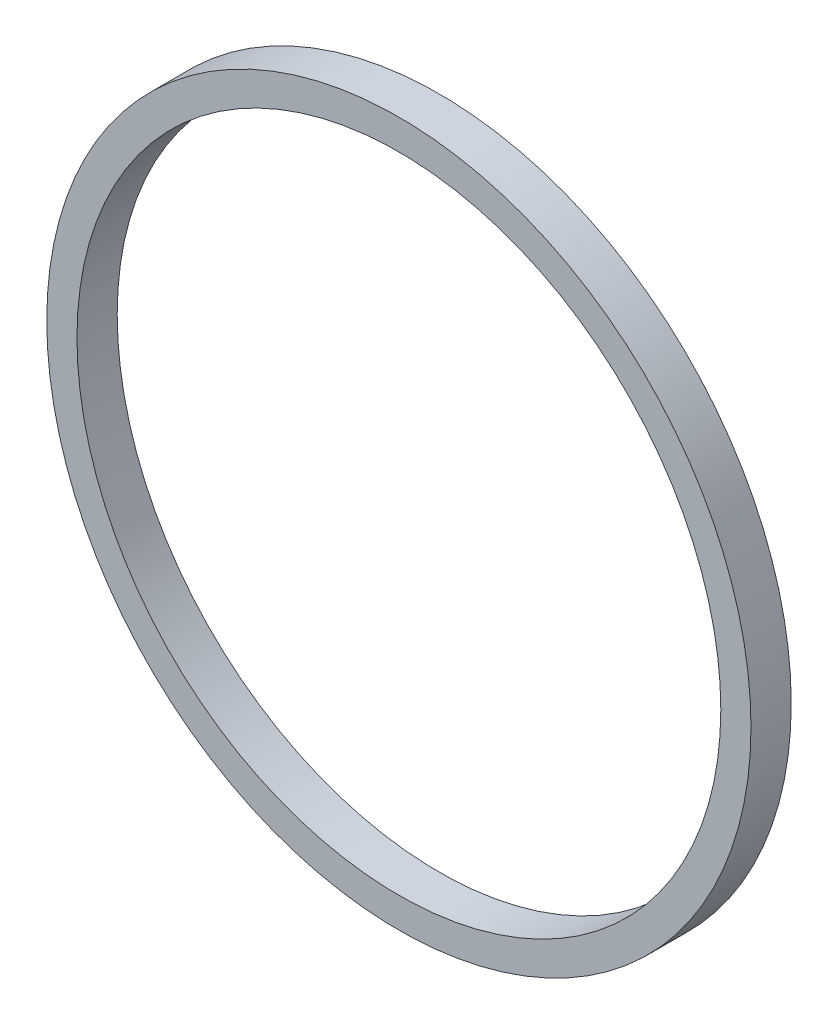
ISO-10303-21;
HEADER;
FILE_DESCRIPTION(('STEP AP214'),'2;1');
FILE_NAME('part.step','',(''),(''),'','','');
FILE_SCHEMA(('AUTOMOTIVE_DESIGN { 1 0 10303 214 1 1 1 1 }'));
ENDSEC;
DATA;
#1=APPLICATION_CONTEXT('core data for automotive mechanical design processes');
#2=APPLICATION_PROTOCOL_DEFINITION('international standard','automotive_design',2000,#1);
#3=PRODUCT_CONTEXT('',#1,'mechanical');
#4=PRODUCT('Part','Part','',(#3));
#5=PRODUCT_RELATED_PRODUCT_CATEGORY('part','',(#4));
#6=PRODUCT_DEFINITION_FORMATION('','',#4);
#7=PRODUCT_DEFINITION_CONTEXT('part definition',#1,'design');
#8=PRODUCT_DEFINITION('design','',#6,#7);
#9=PRODUCT_DEFINITION_SHAPE('','',#8);
#10=(LENGTH_UNIT() NAMED_UNIT(*) SI_UNIT(.MILLI.,.METRE.));
#11=(NAMED_UNIT(*) PLANE_ANGLE_UNIT() SI_UNIT($,.RADIAN.));
#12=(NAMED_UNIT(*) SI_UNIT($,.STERADIAN.) SOLID_ANGLE_UNIT());
#13=UNCERTAINTY_MEASURE_WITH_UNIT(LENGTH_MEASURE(1.E-05),#10,'distance_accuracy_value','');
#14=(GEOMETRIC_REPRESENTATION_CONTEXT(3) GLOBAL_UNCERTAINTY_ASSIGNED_CONTEXT((#13)) GLOBAL_UNIT_ASSIGNED_CONTEXT((#10,
#11,#12)) REPRESENTATION_CONTEXT('',''));
#15=CARTESIAN_POINT('',(0.,0.,0.));
#16=DIRECTION('',(0.,0.,1.));
#17=DIRECTION('',(1.,0.,0.));
#18=AXIS2_PLACEMENT_3D('',#15,#16,#17);
#19=CARTESIAN_POINT('',(0.,0.,2.));
#20=DIRECTION('',(0.,0.,1.));
#21=DIRECTION('',(1.,0.,0.));
#22=AXIS2_PLACEMENT_3D('',#19,#20,#21);
#23=PLANE('',#22);
#24=CARTESIAN_POINT('',(0.,0.,2.));
#25=DIRECTION('',(0.,0.,1.));
#26=DIRECTION('',(1.,0.,0.));
#27=AXIS2_PLACEMENT_3D('',#24,#25,#26);
#28=CIRCLE('',#27,17.5);
#29=CARTESIAN_POINT('',(17.5,0.,2.));
#30=VERTEX_POINT('',#29);
#31=EDGE_CURVE('E10',#30,#30,#28,.T.);
#32=ORIENTED_EDGE('',*,*,#31,.T.);
#33=EDGE_LOOP('',(#32));
#34=FACE_BOUND('',#33,.T.);
#35=CARTESIAN_POINT('',(0.,0.,2.));
#36=DIRECTION('',(0.,0.,1.));
#37=DIRECTION('',(1.,0.,0.));
#38=AXIS2_PLACEMENT_3D('',#35,#36,#37);
#39=CIRCLE('',#38,16.);
#40=CARTESIAN_POINT('',(16.,0.,2.));
#41=VERTEX_POINT('',#40);
#42=EDGE_CURVE('E42',#41,#41,#39,.T.);
#43=ORIENTED_EDGE('',*,*,#42,.F.);
#44=EDGE_LOOP('',(#43));
#45=FACE_BOUND('',#44,.T.);
#46=ADVANCED_FACE('F31',(#34,#45),#23,.T.);
#47=CARTESIAN_POINT('',(0.,0.,0.));
#48=DIRECTION('',(0.,0.,1.));
#49=DIRECTION('',(1.,0.,0.));
#50=AXIS2_PLACEMENT_3D('',#47,#48,#49);
#51=PLANE('',#50);
#52=CARTESIAN_POINT('',(0.,0.,0.));
#53=DIRECTION('',(0.,0.,1.));
#54=DIRECTION('',(1.,0.,0.));
#55=AXIS2_PLACEMENT_3D('',#52,#53,#54);
#56=CIRCLE('',#55,17.5);
#57=CARTESIAN_POINT('',(17.5,0.,0.));
#58=VERTEX_POINT('',#57);
#59=EDGE_CURVE('E35',#58,#58,#56,.T.);
#60=ORIENTED_EDGE('',*,*,#59,.F.);
#61=EDGE_LOOP('',(#60));
#62=FACE_BOUND('',#61,.T.);
#63=CARTESIAN_POINT('',(0.,0.,0.));
#64=DIRECTION('',(0.,0.,1.));
#65=DIRECTION('',(1.,0.,0.));
#66=AXIS2_PLACEMENT_3D('',#63,#64,#65);
#67=CIRCLE('',#66,16.);
#68=CARTESIAN_POINT('',(16.,0.,0.));
#69=VERTEX_POINT('',#68);
#70=EDGE_CURVE('E44',#69,#69,#67,.T.);
#71=ORIENTED_EDGE('',*,*,#70,.T.);
#72=EDGE_LOOP('',(#71));
#73=FACE_BOUND('',#72,.T.);
#74=ADVANCED_FACE('F54',(#62,#73),#51,.F.);
#75=CARTESIAN_POINT('',(0.,0.,2.));
#76=DIRECTION('',(0.,0.,-1.));
#77=DIRECTION('',(-1.,0.,0.));
#78=AXIS2_PLACEMENT_3D('',#75,#76,#77);
#79=CYLINDRICAL_SURFACE('',#78,17.5);
#80=ORIENTED_EDGE('',*,*,#31,.F.);
#81=EDGE_LOOP('',(#80));
#82=FACE_BOUND('',#81,.T.);
#83=ORIENTED_EDGE('',*,*,#59,.T.);
#84=EDGE_LOOP('',(#83));
#85=FACE_BOUND('',#84,.T.);
#86=ADVANCED_FACE('F33',(#82,#85),#79,.T.);
#87=CARTESIAN_POINT('',(0.,0.,2.));
#88=DIRECTION('',(0.,0.,-1.));
#89=DIRECTION('',(-1.,0.,0.));
#90=AXIS2_PLACEMENT_3D('',#87,#88,#89);
#91=CYLINDRICAL_SURFACE('',#90,16.);
#92=ORIENTED_EDGE('',*,*,#42,.T.);
#93=EDGE_LOOP('',(#92));
#94=FACE_BOUND('',#93,.T.);
#95=ORIENTED_EDGE('',*,*,#70,.F.);
#96=EDGE_LOOP('',(#95));
#97=FACE_BOUND('',#96,.T.);
#98=ADVANCED_FACE('F50',(#94,#97),#91,.F.);
#99=CLOSED_SHELL('',(#46,#74,#86,#98));
#100=MANIFOLD_SOLID_BREP('B2',#99);
#101=ADVANCED_BREP_SHAPE_REPRESENTATION('',(#18,#100),#14);
#102=SHAPE_DEFINITION_REPRESENTATION(#9,#101);
ENDSEC;
END-ISO-10303-21;
